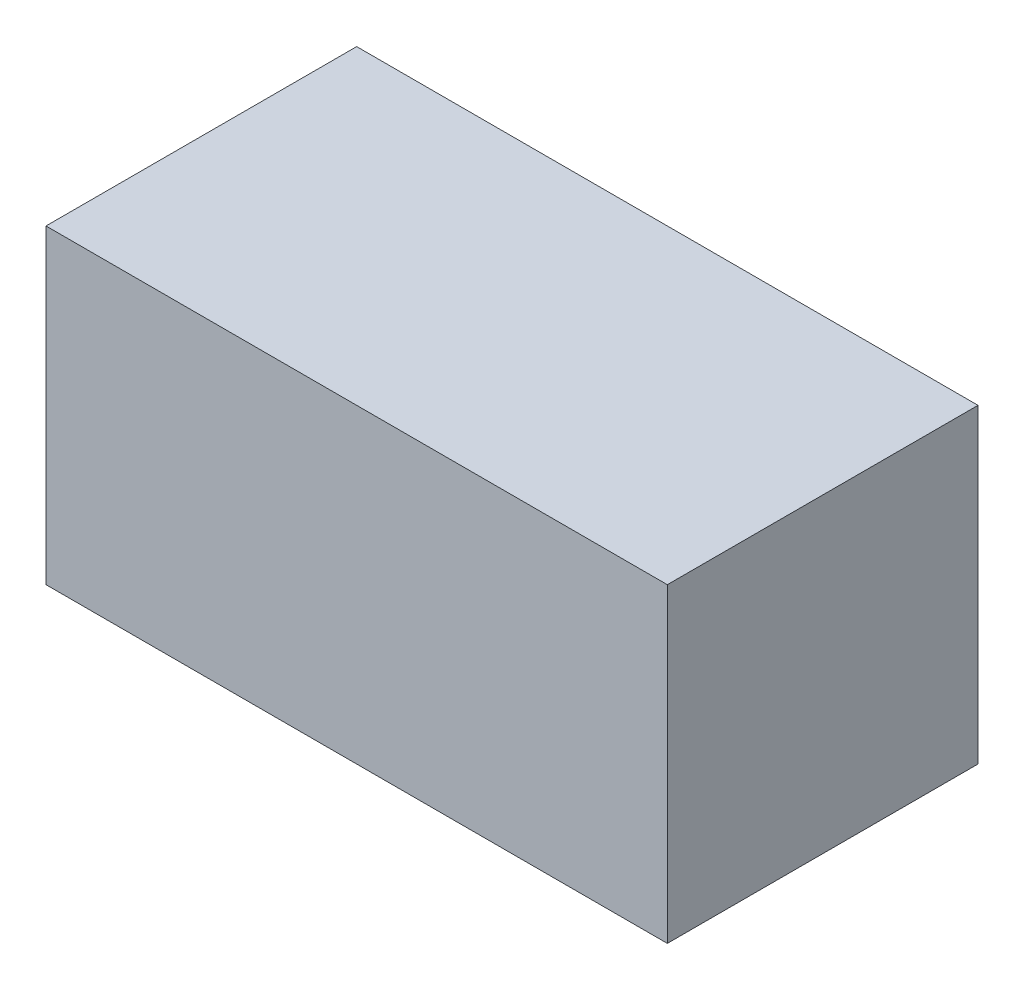
ISO-10303-21;
HEADER;
FILE_DESCRIPTION(('STEP AP214'),'2;1');
FILE_NAME('part.step','',(''),(''),'','','');
FILE_SCHEMA(('AUTOMOTIVE_DESIGN { 1 0 10303 214 1 1 1 1 }'));
ENDSEC;
DATA;
#1=APPLICATION_CONTEXT('core data for automotive mechanical design processes');
#2=APPLICATION_PROTOCOL_DEFINITION('international standard','automotive_design',2000,#1);
#3=PRODUCT_CONTEXT('',#1,'mechanical');
#4=PRODUCT('Part','Part','',(#3));
#5=PRODUCT_RELATED_PRODUCT_CATEGORY('part','',(#4));
#6=PRODUCT_DEFINITION_FORMATION('','',#4);
#7=PRODUCT_DEFINITION_CONTEXT('part definition',#1,'design');
#8=PRODUCT_DEFINITION('design','',#6,#7);
#9=PRODUCT_DEFINITION_SHAPE('','',#8);
#10=(LENGTH_UNIT() NAMED_UNIT(*) SI_UNIT(.MILLI.,.METRE.));
#11=(NAMED_UNIT(*) PLANE_ANGLE_UNIT() SI_UNIT($,.RADIAN.));
#12=(NAMED_UNIT(*) SI_UNIT($,.STERADIAN.) SOLID_ANGLE_UNIT());
#13=UNCERTAINTY_MEASURE_WITH_UNIT(LENGTH_MEASURE(1.E-05),#10,'distance_accuracy_value','');
#14=(GEOMETRIC_REPRESENTATION_CONTEXT(3) GLOBAL_UNCERTAINTY_ASSIGNED_CONTEXT((#13)) GLOBAL_UNIT_ASSIGNED_CONTEXT((#10,
#11,#12)) REPRESENTATION_CONTEXT('',''));
#15=CARTESIAN_POINT('',(0.,0.,0.));
#16=DIRECTION('',(0.,0.,1.));
#17=DIRECTION('',(1.,0.,0.));
#18=AXIS2_PLACEMENT_3D('',#15,#16,#17);
#19=CARTESIAN_POINT('',(0.,50.,0.));
#20=DIRECTION('',(1.,0.,0.));
#21=DIRECTION('',(0.,0.,-1.));
#22=AXIS2_PLACEMENT_3D('',#19,#20,#21);
#23=PLANE('',#22);
#24=DIRECTION('',(0.,0.,1.));
#25=VECTOR('',#24,1.);
#26=CARTESIAN_POINT('',(0.,0.,0.));
#27=LINE('',#26,#25);
#28=CARTESIAN_POINT('',(0.,0.,-50.));
#29=VERTEX_POINT('',#28);
#30=CARTESIAN_POINT('',(0.,0.,0.));
#31=VERTEX_POINT('',#30);
#32=EDGE_CURVE('E105',#29,#31,#27,.T.);
#33=ORIENTED_EDGE('',*,*,#32,.T.);
#34=DIRECTION('',(0.,-1.,0.));
#35=VECTOR('',#34,1.);
#36=CARTESIAN_POINT('',(0.,50.,0.));
#37=LINE('',#36,#35);
#38=CARTESIAN_POINT('',(0.,50.,0.));
#39=VERTEX_POINT('',#38);
#40=EDGE_CURVE('E11',#39,#31,#37,.T.);
#41=ORIENTED_EDGE('',*,*,#40,.F.);
#42=DIRECTION('',(0.,0.,1.));
#43=VECTOR('',#42,1.);
#44=CARTESIAN_POINT('',(0.,50.,0.));
#45=LINE('',#44,#43);
#46=CARTESIAN_POINT('',(0.,50.,-50.));
#47=VERTEX_POINT('',#46);
#48=EDGE_CURVE('E93',#47,#39,#45,.T.);
#49=ORIENTED_EDGE('',*,*,#48,.F.);
#50=DIRECTION('',(0.,-1.,0.));
#51=VECTOR('',#50,1.);
#52=CARTESIAN_POINT('',(0.,50.,-50.));
#53=LINE('',#52,#51);
#54=EDGE_CURVE('E101',#47,#29,#53,.T.);
#55=ORIENTED_EDGE('',*,*,#54,.T.);
#56=EDGE_LOOP('',(#33,#41,#49,#55));
#57=FACE_BOUND('',#56,.T.);
#58=ADVANCED_FACE('F42',(#57),#23,.F.);
#59=CARTESIAN_POINT('',(0.,50.,0.));
#60=DIRECTION('',(0.,0.,-1.));
#61=DIRECTION('',(-1.,0.,0.));
#62=AXIS2_PLACEMENT_3D('',#59,#60,#61);
#63=PLANE('',#62);
#64=DIRECTION('',(1.,0.,0.));
#65=VECTOR('',#64,1.);
#66=CARTESIAN_POINT('',(0.,0.,0.));
#67=LINE('',#66,#65);
#68=CARTESIAN_POINT('',(100.,0.,0.));
#69=VERTEX_POINT('',#68);
#70=EDGE_CURVE('E97',#31,#69,#67,.T.);
#71=ORIENTED_EDGE('',*,*,#70,.T.);
#72=DIRECTION('',(0.,-1.,0.));
#73=VECTOR('',#72,1.);
#74=CARTESIAN_POINT('',(100.,50.,0.));
#75=LINE('',#74,#73);
#76=CARTESIAN_POINT('',(100.,50.,0.));
#77=VERTEX_POINT('',#76);
#78=EDGE_CURVE('E50',#77,#69,#75,.T.);
#79=ORIENTED_EDGE('',*,*,#78,.F.);
#80=DIRECTION('',(1.,0.,0.));
#81=VECTOR('',#80,1.);
#82=CARTESIAN_POINT('',(0.,50.,0.));
#83=LINE('',#82,#81);
#84=EDGE_CURVE('E88',#39,#77,#83,.T.);
#85=ORIENTED_EDGE('',*,*,#84,.F.);
#86=ORIENTED_EDGE('',*,*,#40,.T.);
#87=EDGE_LOOP('',(#71,#79,#85,#86));
#88=FACE_BOUND('',#87,.T.);
#89=ADVANCED_FACE('F96',(#88),#63,.F.);
#90=CARTESIAN_POINT('',(100.,50.,0.));
#91=DIRECTION('',(-1.,0.,0.));
#92=DIRECTION('',(0.,0.,1.));
#93=AXIS2_PLACEMENT_3D('',#90,#91,#92);
#94=PLANE('',#93);
#95=DIRECTION('',(0.,0.,-1.));
#96=VECTOR('',#95,1.);
#97=CARTESIAN_POINT('',(100.,0.,0.));
#98=LINE('',#97,#96);
#99=CARTESIAN_POINT('',(100.,0.,-50.));
#100=VERTEX_POINT('',#99);
#101=EDGE_CURVE('E75',#69,#100,#98,.T.);
#102=ORIENTED_EDGE('',*,*,#101,.T.);
#103=DIRECTION('',(0.,-1.,0.));
#104=VECTOR('',#103,1.);
#105=CARTESIAN_POINT('',(100.,50.,-50.));
#106=LINE('',#105,#104);
#107=CARTESIAN_POINT('',(100.,50.,-50.));
#108=VERTEX_POINT('',#107);
#109=EDGE_CURVE('E98',#108,#100,#106,.T.);
#110=ORIENTED_EDGE('',*,*,#109,.F.);
#111=DIRECTION('',(0.,0.,-1.));
#112=VECTOR('',#111,1.);
#113=CARTESIAN_POINT('',(100.,50.,0.));
#114=LINE('',#113,#112);
#115=EDGE_CURVE('E91',#77,#108,#114,.T.);
#116=ORIENTED_EDGE('',*,*,#115,.F.);
#117=ORIENTED_EDGE('',*,*,#78,.T.);
#118=EDGE_LOOP('',(#102,#110,#116,#117));
#119=FACE_BOUND('',#118,.T.);
#120=ADVANCED_FACE('F99',(#119),#94,.F.);
#121=CARTESIAN_POINT('',(0.,50.,-50.));
#122=DIRECTION('',(0.,0.,1.));
#123=DIRECTION('',(1.,0.,0.));
#124=AXIS2_PLACEMENT_3D('',#121,#122,#123);
#125=PLANE('',#124);
#126=DIRECTION('',(-1.,0.,0.));
#127=VECTOR('',#126,1.);
#128=CARTESIAN_POINT('',(0.,0.,-50.));
#129=LINE('',#128,#127);
#130=EDGE_CURVE('E81',#100,#29,#129,.T.);
#131=ORIENTED_EDGE('',*,*,#130,.T.);
#132=ORIENTED_EDGE('',*,*,#54,.F.);
#133=DIRECTION('',(-1.,0.,0.));
#134=VECTOR('',#133,1.);
#135=CARTESIAN_POINT('',(0.,50.,-50.));
#136=LINE('',#135,#134);
#137=EDGE_CURVE('E58',#108,#47,#136,.T.);
#138=ORIENTED_EDGE('',*,*,#137,.F.);
#139=ORIENTED_EDGE('',*,*,#109,.T.);
#140=EDGE_LOOP('',(#131,#132,#138,#139));
#141=FACE_BOUND('',#140,.T.);
#142=ADVANCED_FACE('F112',(#141),#125,.F.);
#143=CARTESIAN_POINT('',(0.,50.,0.));
#144=DIRECTION('',(0.,-1.,0.));
#145=DIRECTION('',(0.,0.,-1.));
#146=AXIS2_PLACEMENT_3D('',#143,#144,#145);
#147=PLANE('',#146);
#148=ORIENTED_EDGE('',*,*,#48,.T.);
#149=ORIENTED_EDGE('',*,*,#84,.T.);
#150=ORIENTED_EDGE('',*,*,#115,.T.);
#151=ORIENTED_EDGE('',*,*,#137,.T.);
#152=EDGE_LOOP('',(#148,#149,#150,#151));
#153=FACE_BOUND('',#152,.T.);
#154=ADVANCED_FACE('F89',(#153),#147,.F.);
#155=CARTESIAN_POINT('',(0.,0.,0.));
#156=DIRECTION('',(0.,-1.,0.));
#157=DIRECTION('',(0.,0.,-1.));
#158=AXIS2_PLACEMENT_3D('',#155,#156,#157);
#159=PLANE('',#158);
#160=ORIENTED_EDGE('',*,*,#32,.F.);
#161=ORIENTED_EDGE('',*,*,#130,.F.);
#162=ORIENTED_EDGE('',*,*,#101,.F.);
#163=ORIENTED_EDGE('',*,*,#70,.F.);
#164=EDGE_LOOP('',(#160,#161,#162,#163));
#165=FACE_BOUND('',#164,.T.);
#166=ADVANCED_FACE('F115',(#165),#159,.T.);
#167=CLOSED_SHELL('',(#58,#89,#120,#142,#154,#166));
#168=MANIFOLD_SOLID_BREP('B2',#167);
#169=ADVANCED_BREP_SHAPE_REPRESENTATION('',(#18,#168),#14);
#170=SHAPE_DEFINITION_REPRESENTATION(#9,#169);
ENDSEC;
END-ISO-10303-21;
